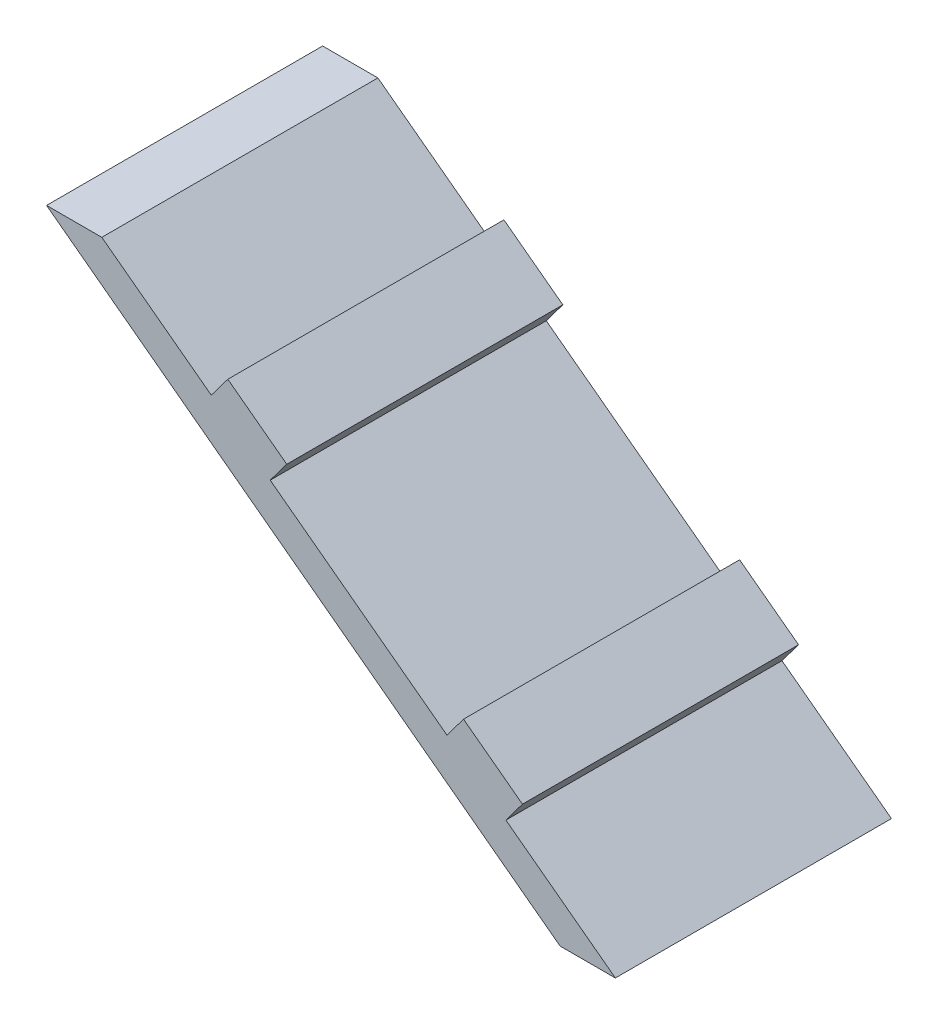
ISO-10303-21;
HEADER;
FILE_DESCRIPTION(('STEP AP214'),'2;1');
FILE_NAME('part.step','',(''),(''),'','','');
FILE_SCHEMA(('AUTOMOTIVE_DESIGN { 1 0 10303 214 1 1 1 1 }'));
ENDSEC;
DATA;
#1=APPLICATION_CONTEXT('core data for automotive mechanical design processes');
#2=APPLICATION_PROTOCOL_DEFINITION('international standard','automotive_design',2000,#1);
#3=PRODUCT_CONTEXT('',#1,'mechanical');
#4=PRODUCT('Part','Part','',(#3));
#5=PRODUCT_RELATED_PRODUCT_CATEGORY('part','',(#4));
#6=PRODUCT_DEFINITION_FORMATION('','',#4);
#7=PRODUCT_DEFINITION_CONTEXT('part definition',#1,'design');
#8=PRODUCT_DEFINITION('design','',#6,#7);
#9=PRODUCT_DEFINITION_SHAPE('','',#8);
#10=(LENGTH_UNIT() NAMED_UNIT(*) SI_UNIT(.MILLI.,.METRE.));
#11=(NAMED_UNIT(*) PLANE_ANGLE_UNIT() SI_UNIT($,.RADIAN.));
#12=(NAMED_UNIT(*) SI_UNIT($,.STERADIAN.) SOLID_ANGLE_UNIT());
#13=UNCERTAINTY_MEASURE_WITH_UNIT(LENGTH_MEASURE(1.E-05),#10,'distance_accuracy_value','');
#14=(GEOMETRIC_REPRESENTATION_CONTEXT(3) GLOBAL_UNCERTAINTY_ASSIGNED_CONTEXT((#13)) GLOBAL_UNIT_ASSIGNED_CONTEXT((#10,
#11,#12)) REPRESENTATION_CONTEXT('',''));
#15=CARTESIAN_POINT('',(0.,0.,0.));
#16=DIRECTION('',(0.,0.,1.));
#17=DIRECTION('',(1.,0.,0.));
#18=AXIS2_PLACEMENT_3D('',#15,#16,#17);
#19=CARTESIAN_POINT('',(-87.0246721025996,495.,-157.085107118555));
#20=DIRECTION('',(-0.599506963422979,-0.800369540154645,0.));
#21=DIRECTION('',(0.800369540154645,-0.599506963422979,0.));
#22=AXIS2_PLACEMENT_3D('',#19,#20,#21);
#23=PLANE('',#22);
#24=DIRECTION('',(-0.800369540154645,0.599506963422979,0.));
#25=VECTOR('',#24,1.);
#26=CARTESIAN_POINT('',(-87.0246721025996,495.,216.));
#27=LINE('',#26,#25);
#28=CARTESIAN_POINT('',(191.999999999998,286.,216.));
#29=VERTEX_POINT('',#28);
#30=CARTESIAN_POINT('',(-87.0246721025996,495.,216.));
#31=VERTEX_POINT('',#30);
#32=EDGE_CURVE('E169',#29,#31,#27,.T.);
#33=ORIENTED_EDGE('',*,*,#32,.F.);
#34=DIRECTION('',(0.,0.,1.));
#35=VECTOR('',#34,1.);
#36=CARTESIAN_POINT('',(191.999999999998,286.,-157.085107118555));
#37=LINE('',#36,#35);
#38=CARTESIAN_POINT('',(191.999999999998,286.,366.));
#39=VERTEX_POINT('',#38);
#40=EDGE_CURVE('E204',#29,#39,#37,.T.);
#41=ORIENTED_EDGE('',*,*,#40,.T.);
#42=DIRECTION('',(0.800369540154645,-0.599506963422979,0.));
#43=VECTOR('',#42,1.);
#44=CARTESIAN_POINT('',(-87.0246721025996,495.,366.));
#45=LINE('',#44,#43);
#46=CARTESIAN_POINT('',(-87.0246721025996,495.,366.));
#47=VERTEX_POINT('',#46);
#48=EDGE_CURVE('E222',#47,#39,#45,.T.);
#49=ORIENTED_EDGE('',*,*,#48,.F.);
#50=DIRECTION('',(0.,0.,1.));
#51=VECTOR('',#50,1.);
#52=CARTESIAN_POINT('',(-87.0246721025996,495.,-157.085107118555));
#53=LINE('',#52,#51);
#54=EDGE_CURVE('E201',#31,#47,#53,.T.);
#55=ORIENTED_EDGE('',*,*,#54,.F.);
#56=EDGE_LOOP('',(#33,#41,#49,#55));
#57=FACE_BOUND('',#56,.T.);
#58=ADVANCED_FACE('F87',(#57),#23,.T.);
#59=CARTESIAN_POINT('',(191.999999999998,286.,-157.085107118555));
#60=DIRECTION('',(0.,-1.,0.));
#61=DIRECTION('',(0.,0.,-1.));
#62=AXIS2_PLACEMENT_3D('',#59,#60,#61);
#63=PLANE('',#62);
#64=DIRECTION('',(-1.,0.,0.));
#65=VECTOR('',#64,1.);
#66=CARTESIAN_POINT('',(191.999999999998,286.,216.));
#67=LINE('',#66,#65);
#68=CARTESIAN_POINT('',(222.0246721026,286.,216.));
#69=VERTEX_POINT('',#68);
#70=EDGE_CURVE('E214',#69,#29,#67,.T.);
#71=ORIENTED_EDGE('',*,*,#70,.F.);
#72=DIRECTION('',(0.,0.,1.));
#73=VECTOR('',#72,1.);
#74=CARTESIAN_POINT('',(222.0246721026,286.,-157.085107118555));
#75=LINE('',#74,#73);
#76=CARTESIAN_POINT('',(222.0246721026,286.,366.));
#77=VERTEX_POINT('',#76);
#78=EDGE_CURVE('E208',#69,#77,#75,.T.);
#79=ORIENTED_EDGE('',*,*,#78,.T.);
#80=DIRECTION('',(1.,0.,0.));
#81=VECTOR('',#80,1.);
#82=CARTESIAN_POINT('',(191.999999999998,286.,366.));
#83=LINE('',#82,#81);
#84=EDGE_CURVE('E219',#39,#77,#83,.T.);
#85=ORIENTED_EDGE('',*,*,#84,.F.);
#86=ORIENTED_EDGE('',*,*,#40,.F.);
#87=EDGE_LOOP('',(#71,#79,#85,#86));
#88=FACE_BOUND('',#87,.T.);
#89=ADVANCED_FACE('F309',(#88),#63,.T.);
#90=CARTESIAN_POINT('',(222.0246721026,286.,-157.085107118555));
#91=DIRECTION('',(0.599506963422976,0.800369540154648,0.));
#92=DIRECTION('',(-0.800369540154648,0.599506963422976,0.));
#93=AXIS2_PLACEMENT_3D('',#90,#91,#92);
#94=PLANE('',#93);
#95=DIRECTION('',(0.800369540154648,-0.599506963422976,0.));
#96=VECTOR('',#95,1.);
#97=CARTESIAN_POINT('',(222.0246721026,286.,216.));
#98=LINE('',#97,#96);
#99=CARTESIAN_POINT('',(162.549290066764,330.549303657703,216.));
#100=VERTEX_POINT('',#99);
#101=EDGE_CURVE('E232',#100,#69,#98,.T.);
#102=ORIENTED_EDGE('',*,*,#101,.F.);
#103=DIRECTION('',(0.,0.,1.));
#104=VECTOR('',#103,1.);
#105=CARTESIAN_POINT('',(162.549290066763,330.549303657702,-157.085107118555));
#106=LINE('',#105,#104);
#107=CARTESIAN_POINT('',(162.549290066764,330.549303657703,366.));
#108=VERTEX_POINT('',#107);
#109=EDGE_CURVE('E157',#100,#108,#106,.T.);
#110=ORIENTED_EDGE('',*,*,#109,.T.);
#111=DIRECTION('',(-0.800369540154648,0.599506963422976,0.));
#112=VECTOR('',#111,1.);
#113=CARTESIAN_POINT('',(222.0246721026,286.,366.));
#114=LINE('',#113,#112);
#115=EDGE_CURVE('E205',#77,#108,#114,.T.);
#116=ORIENTED_EDGE('',*,*,#115,.F.);
#117=ORIENTED_EDGE('',*,*,#78,.F.);
#118=EDGE_LOOP('',(#102,#110,#116,#117));
#119=FACE_BOUND('',#118,.T.);
#120=ADVANCED_FACE('F314',(#119),#94,.T.);
#121=CARTESIAN_POINT('',(34.4901636420202,426.470417805379,216.));
#122=VERTEX_POINT('',#121);
#123=CARTESIAN_POINT('',(130.534508460578,354.529582194622,216.));
#124=VERTEX_POINT('',#123);
#125=EDGE_CURVE('E231',#122,#124,#98,.T.);
#126=ORIENTED_EDGE('',*,*,#125,.F.);
#127=DIRECTION('',(0.,0.,1.));
#128=VECTOR('',#127,1.);
#129=CARTESIAN_POINT('',(34.4901636420199,426.470417805379,-157.085107118555));
#130=LINE('',#129,#128);
#131=CARTESIAN_POINT('',(34.4901636420202,426.470417805379,366.));
#132=VERTEX_POINT('',#131);
#133=EDGE_CURVE('E12',#122,#132,#130,.T.);
#134=ORIENTED_EDGE('',*,*,#133,.T.);
#135=CARTESIAN_POINT('',(130.534508460578,354.529582194622,366.));
#136=VERTEX_POINT('',#135);
#137=EDGE_CURVE('E217',#136,#132,#114,.T.);
#138=ORIENTED_EDGE('',*,*,#137,.F.);
#139=DIRECTION('',(0.,0.,1.));
#140=VECTOR('',#139,1.);
#141=CARTESIAN_POINT('',(130.534508460577,354.529582194621,-157.085107118555));
#142=LINE('',#141,#140);
#143=EDGE_CURVE('E167',#124,#136,#142,.T.);
#144=ORIENTED_EDGE('',*,*,#143,.F.);
#145=EDGE_LOOP('',(#126,#134,#138,#144));
#146=FACE_BOUND('',#145,.T.);
#147=ADVANCED_FACE('F245',(#146),#94,.T.);
#148=DIRECTION('',(0.,0.,1.));
#149=VECTOR('',#148,1.);
#150=CARTESIAN_POINT('',(2.47538203583415,450.450696342298,-157.085107118555));
#151=LINE('',#150,#149);
#152=CARTESIAN_POINT('',(2.47538203583428,450.450696342298,216.));
#153=VERTEX_POINT('',#152);
#154=CARTESIAN_POINT('',(2.47538203583431,450.450696342298,366.));
#155=VERTEX_POINT('',#154);
#156=EDGE_CURVE('E97',#153,#155,#151,.T.);
#157=ORIENTED_EDGE('',*,*,#156,.F.);
#158=CARTESIAN_POINT('',(-57.0000000000002,495.,216.));
#159=VERTEX_POINT('',#158);
#160=EDGE_CURVE('E228',#159,#153,#98,.T.);
#161=ORIENTED_EDGE('',*,*,#160,.F.);
#162=DIRECTION('',(0.,0.,1.));
#163=VECTOR('',#162,1.);
#164=CARTESIAN_POINT('',(-57.0000000000002,495.,-157.085107118555));
#165=LINE('',#164,#163);
#166=CARTESIAN_POINT('',(-57.0000000000002,495.,366.));
#167=VERTEX_POINT('',#166);
#168=EDGE_CURVE('E211',#159,#167,#165,.T.);
#169=ORIENTED_EDGE('',*,*,#168,.T.);
#170=EDGE_CURVE('E218',#155,#167,#114,.T.);
#171=ORIENTED_EDGE('',*,*,#170,.F.);
#172=EDGE_LOOP('',(#157,#161,#169,#171));
#173=FACE_BOUND('',#172,.T.);
#174=ADVANCED_FACE('F272',(#173),#94,.T.);
#175=CARTESIAN_POINT('',(-57.0000000000002,495.,-157.085107118555));
#176=DIRECTION('',(0.,1.,0.));
#177=DIRECTION('',(0.,0.,1.));
#178=AXIS2_PLACEMENT_3D('',#175,#176,#177);
#179=PLANE('',#178);
#180=DIRECTION('',(1.,0.,0.));
#181=VECTOR('',#180,1.);
#182=CARTESIAN_POINT('',(-57.0000000000002,495.,216.));
#183=LINE('',#182,#181);
#184=EDGE_CURVE('E200',#31,#159,#183,.T.);
#185=ORIENTED_EDGE('',*,*,#184,.F.);
#186=ORIENTED_EDGE('',*,*,#54,.T.);
#187=DIRECTION('',(-1.,0.,0.));
#188=VECTOR('',#187,1.);
#189=CARTESIAN_POINT('',(-57.0000000000002,495.,366.));
#190=LINE('',#189,#188);
#191=EDGE_CURVE('E192',#167,#47,#190,.T.);
#192=ORIENTED_EDGE('',*,*,#191,.F.);
#193=ORIENTED_EDGE('',*,*,#168,.F.);
#194=EDGE_LOOP('',(#185,#186,#192,#193));
#195=FACE_BOUND('',#194,.T.);
#196=ADVANCED_FACE('F276',(#195),#179,.T.);
#197=CARTESIAN_POINT('',(182.,286.,216.));
#198=DIRECTION('',(0.,0.,1.));
#199=DIRECTION('',(1.,0.,0.));
#200=AXIS2_PLACEMENT_3D('',#197,#198,#199);
#201=PLANE('',#200);
#202=ORIENTED_EDGE('',*,*,#184,.T.);
#203=ORIENTED_EDGE('',*,*,#160,.T.);
#204=DIRECTION('',(-0.59950696342298,-0.800369540154645,0.));
#205=VECTOR('',#204,1.);
#206=CARTESIAN_POINT('',(2.47538203583415,450.450696342298,216.));
#207=LINE('',#206,#205);
#208=CARTESIAN_POINT('',(11.4679864871788,462.456239444618,216.));
#209=VERTEX_POINT('',#208);
#210=EDGE_CURVE('E190',#209,#153,#207,.T.);
#211=ORIENTED_EDGE('',*,*,#210,.F.);
#212=DIRECTION('',(-0.800369540154645,0.59950696342298,0.));
#213=VECTOR('',#212,1.);
#214=CARTESIAN_POINT('',(11.4679864871788,462.456239444618,216.));
#215=LINE('',#214,#213);
#216=CARTESIAN_POINT('',(43.4827680933646,438.475960907698,216.));
#217=VERTEX_POINT('',#216);
#218=EDGE_CURVE('E193',#217,#209,#215,.T.);
#219=ORIENTED_EDGE('',*,*,#218,.F.);
#220=DIRECTION('',(-0.59950696342298,-0.800369540154645,0.));
#221=VECTOR('',#220,1.);
#222=CARTESIAN_POINT('',(34.4901636420199,426.470417805379,216.));
#223=LINE('',#222,#221);
#224=EDGE_CURVE('E179',#217,#122,#223,.T.);
#225=ORIENTED_EDGE('',*,*,#224,.T.);
#226=ORIENTED_EDGE('',*,*,#125,.T.);
#227=DIRECTION('',(-0.59950696342298,-0.800369540154645,0.));
#228=VECTOR('',#227,1.);
#229=CARTESIAN_POINT('',(130.534508460577,354.529582194621,216.));
#230=LINE('',#229,#228);
#231=CARTESIAN_POINT('',(139.527112911922,366.535125296941,216.));
#232=VERTEX_POINT('',#231);
#233=EDGE_CURVE('E135',#232,#124,#230,.T.);
#234=ORIENTED_EDGE('',*,*,#233,.F.);
#235=DIRECTION('',(-0.800369540154646,0.599506963422978,0.));
#236=VECTOR('',#235,1.);
#237=CARTESIAN_POINT('',(139.527112911922,366.535125296941,216.));
#238=LINE('',#237,#236);
#239=CARTESIAN_POINT('',(171.541894518108,342.554846760022,216.));
#240=VERTEX_POINT('',#239);
#241=EDGE_CURVE('E138',#240,#232,#238,.T.);
#242=ORIENTED_EDGE('',*,*,#241,.F.);
#243=DIRECTION('',(-0.59950696342298,-0.800369540154645,0.));
#244=VECTOR('',#243,1.);
#245=CARTESIAN_POINT('',(162.549290066763,330.549303657702,216.));
#246=LINE('',#245,#244);
#247=EDGE_CURVE('E144',#240,#100,#246,.T.);
#248=ORIENTED_EDGE('',*,*,#247,.T.);
#249=ORIENTED_EDGE('',*,*,#101,.T.);
#250=ORIENTED_EDGE('',*,*,#70,.T.);
#251=ORIENTED_EDGE('',*,*,#32,.T.);
#252=EDGE_LOOP('',(#202,#203,#211,#219,#225,#226,#234,#242,#248,#249,#250,#251));
#253=FACE_BOUND('',#252,.T.);
#254=ADVANCED_FACE('F141',(#253),#201,.F.);
#255=CARTESIAN_POINT('',(0.,0.,366.));
#256=DIRECTION('',(0.,0.,1.));
#257=DIRECTION('',(1.,0.,0.));
#258=AXIS2_PLACEMENT_3D('',#255,#256,#257);
#259=PLANE('',#258);
#260=ORIENTED_EDGE('',*,*,#191,.T.);
#261=ORIENTED_EDGE('',*,*,#48,.T.);
#262=ORIENTED_EDGE('',*,*,#84,.T.);
#263=ORIENTED_EDGE('',*,*,#115,.T.);
#264=DIRECTION('',(0.59950696342298,0.800369540154645,0.));
#265=VECTOR('',#264,1.);
#266=CARTESIAN_POINT('',(162.549290066763,330.549303657702,366.));
#267=LINE('',#266,#265);
#268=CARTESIAN_POINT('',(171.541894518108,342.554846760022,366.));
#269=VERTEX_POINT('',#268);
#270=EDGE_CURVE('E163',#108,#269,#267,.T.);
#271=ORIENTED_EDGE('',*,*,#270,.T.);
#272=DIRECTION('',(0.800369540154646,-0.599506963422979,0.));
#273=VECTOR('',#272,1.);
#274=CARTESIAN_POINT('',(139.527112911922,366.535125296941,366.));
#275=LINE('',#274,#273);
#276=CARTESIAN_POINT('',(139.527112911922,366.535125296941,366.));
#277=VERTEX_POINT('',#276);
#278=EDGE_CURVE('E161',#277,#269,#275,.T.);
#279=ORIENTED_EDGE('',*,*,#278,.F.);
#280=DIRECTION('',(0.59950696342298,0.800369540154645,0.));
#281=VECTOR('',#280,1.);
#282=CARTESIAN_POINT('',(130.534508460577,354.529582194621,366.));
#283=LINE('',#282,#281);
#284=EDGE_CURVE('E172',#136,#277,#283,.T.);
#285=ORIENTED_EDGE('',*,*,#284,.F.);
#286=ORIENTED_EDGE('',*,*,#137,.T.);
#287=DIRECTION('',(0.59950696342298,0.800369540154645,0.));
#288=VECTOR('',#287,1.);
#289=CARTESIAN_POINT('',(34.4901636420199,426.470417805379,366.));
#290=LINE('',#289,#288);
#291=CARTESIAN_POINT('',(43.4827680933646,438.475960907698,366.));
#292=VERTEX_POINT('',#291);
#293=EDGE_CURVE('E181',#132,#292,#290,.T.);
#294=ORIENTED_EDGE('',*,*,#293,.T.);
#295=DIRECTION('',(0.800369540154645,-0.59950696342298,0.));
#296=VECTOR('',#295,1.);
#297=CARTESIAN_POINT('',(11.4679864871788,462.456239444618,366.));
#298=LINE('',#297,#296);
#299=CARTESIAN_POINT('',(11.4679864871788,462.456239444618,366.));
#300=VERTEX_POINT('',#299);
#301=EDGE_CURVE('E186',#300,#292,#298,.T.);
#302=ORIENTED_EDGE('',*,*,#301,.F.);
#303=DIRECTION('',(0.59950696342298,0.800369540154645,0.));
#304=VECTOR('',#303,1.);
#305=CARTESIAN_POINT('',(2.47538203583415,450.450696342298,366.));
#306=LINE('',#305,#304);
#307=EDGE_CURVE('E175',#155,#300,#306,.T.);
#308=ORIENTED_EDGE('',*,*,#307,.F.);
#309=ORIENTED_EDGE('',*,*,#170,.T.);
#310=EDGE_LOOP('',(#260,#261,#262,#263,#271,#279,#285,#286,#294,#302,#308,#309));
#311=FACE_BOUND('',#310,.T.);
#312=ADVANCED_FACE('F261',(#311),#259,.T.);
#313=CARTESIAN_POINT('',(130.534508460577,354.529582194621,-157.085107118555));
#314=DIRECTION('',(0.800369540154645,-0.59950696342298,0.));
#315=DIRECTION('',(0.59950696342298,0.800369540154645,0.));
#316=AXIS2_PLACEMENT_3D('',#313,#314,#315);
#317=PLANE('',#316);
#318=DIRECTION('',(0.,0.,1.));
#319=VECTOR('',#318,1.);
#320=CARTESIAN_POINT('',(139.527112911922,366.535125296941,-157.085107118555));
#321=LINE('',#320,#319);
#322=EDGE_CURVE('E91',#232,#277,#321,.T.);
#323=ORIENTED_EDGE('',*,*,#322,.F.);
#324=ORIENTED_EDGE('',*,*,#233,.T.);
#325=ORIENTED_EDGE('',*,*,#143,.T.);
#326=ORIENTED_EDGE('',*,*,#284,.T.);
#327=EDGE_LOOP('',(#323,#324,#325,#326));
#328=FACE_BOUND('',#327,.T.);
#329=ADVANCED_FACE('F89',(#328),#317,.F.);
#330=CARTESIAN_POINT('',(162.549290066763,330.549303657702,-157.085107118555));
#331=DIRECTION('',(0.800369540154645,-0.59950696342298,0.));
#332=DIRECTION('',(0.59950696342298,0.800369540154645,0.));
#333=AXIS2_PLACEMENT_3D('',#330,#331,#332);
#334=PLANE('',#333);
#335=ORIENTED_EDGE('',*,*,#247,.F.);
#336=DIRECTION('',(0.,0.,1.));
#337=VECTOR('',#336,1.);
#338=CARTESIAN_POINT('',(171.541894518108,342.554846760022,-157.085107118555));
#339=LINE('',#338,#337);
#340=EDGE_CURVE('E154',#240,#269,#339,.T.);
#341=ORIENTED_EDGE('',*,*,#340,.T.);
#342=ORIENTED_EDGE('',*,*,#270,.F.);
#343=ORIENTED_EDGE('',*,*,#109,.F.);
#344=EDGE_LOOP('',(#335,#341,#342,#343));
#345=FACE_BOUND('',#344,.T.);
#346=ADVANCED_FACE('F152',(#345),#334,.T.);
#347=CARTESIAN_POINT('',(139.527112911922,366.535125296941,-157.085107118555));
#348=DIRECTION('',(-0.599506963422978,-0.800369540154646,0.));
#349=DIRECTION('',(0.800369540154646,-0.599506963422978,0.));
#350=AXIS2_PLACEMENT_3D('',#347,#348,#349);
#351=PLANE('',#350);
#352=ORIENTED_EDGE('',*,*,#340,.F.);
#353=ORIENTED_EDGE('',*,*,#241,.T.);
#354=ORIENTED_EDGE('',*,*,#322,.T.);
#355=ORIENTED_EDGE('',*,*,#278,.T.);
#356=EDGE_LOOP('',(#352,#353,#354,#355));
#357=FACE_BOUND('',#356,.T.);
#358=ADVANCED_FACE('F159',(#357),#351,.F.);
#359=CARTESIAN_POINT('',(2.47538203583415,450.450696342298,-157.085107118555));
#360=DIRECTION('',(0.800369540154645,-0.59950696342298,0.));
#361=DIRECTION('',(0.59950696342298,0.800369540154645,0.));
#362=AXIS2_PLACEMENT_3D('',#359,#360,#361);
#363=PLANE('',#362);
#364=DIRECTION('',(0.,0.,1.));
#365=VECTOR('',#364,1.);
#366=CARTESIAN_POINT('',(11.4679864871788,462.456239444618,-157.085107118555));
#367=LINE('',#366,#365);
#368=EDGE_CURVE('E177',#209,#300,#367,.T.);
#369=ORIENTED_EDGE('',*,*,#368,.F.);
#370=ORIENTED_EDGE('',*,*,#210,.T.);
#371=ORIENTED_EDGE('',*,*,#156,.T.);
#372=ORIENTED_EDGE('',*,*,#307,.T.);
#373=EDGE_LOOP('',(#369,#370,#371,#372));
#374=FACE_BOUND('',#373,.T.);
#375=ADVANCED_FACE('F295',(#374),#363,.F.);
#376=CARTESIAN_POINT('',(34.4901636420199,426.470417805379,-157.085107118555));
#377=DIRECTION('',(0.800369540154645,-0.59950696342298,0.));
#378=DIRECTION('',(0.59950696342298,0.800369540154645,0.));
#379=AXIS2_PLACEMENT_3D('',#376,#377,#378);
#380=PLANE('',#379);
#381=ORIENTED_EDGE('',*,*,#224,.F.);
#382=DIRECTION('',(0.,0.,1.));
#383=VECTOR('',#382,1.);
#384=CARTESIAN_POINT('',(43.4827680933646,438.475960907698,-157.085107118555));
#385=LINE('',#384,#383);
#386=EDGE_CURVE('E180',#217,#292,#385,.T.);
#387=ORIENTED_EDGE('',*,*,#386,.T.);
#388=ORIENTED_EDGE('',*,*,#293,.F.);
#389=ORIENTED_EDGE('',*,*,#133,.F.);
#390=EDGE_LOOP('',(#381,#387,#388,#389));
#391=FACE_BOUND('',#390,.T.);
#392=ADVANCED_FACE('F297',(#391),#380,.T.);
#393=CARTESIAN_POINT('',(11.4679864871788,462.456239444618,-157.085107118555));
#394=DIRECTION('',(-0.59950696342298,-0.800369540154645,0.));
#395=DIRECTION('',(0.800369540154645,-0.59950696342298,0.));
#396=AXIS2_PLACEMENT_3D('',#393,#394,#395);
#397=PLANE('',#396);
#398=ORIENTED_EDGE('',*,*,#386,.F.);
#399=ORIENTED_EDGE('',*,*,#218,.T.);
#400=ORIENTED_EDGE('',*,*,#368,.T.);
#401=ORIENTED_EDGE('',*,*,#301,.T.);
#402=EDGE_LOOP('',(#398,#399,#400,#401));
#403=FACE_BOUND('',#402,.T.);
#404=ADVANCED_FACE('F294',(#403),#397,.F.);
#405=CLOSED_SHELL('',(#58,#89,#120,#147,#174,#196,#254,#312,#329,#346,#358,#375,#392,#404));
#406=MANIFOLD_SOLID_BREP('B2',#405);
#407=ADVANCED_BREP_SHAPE_REPRESENTATION('',(#18,#406),#14);
#408=SHAPE_DEFINITION_REPRESENTATION(#9,#407);
ENDSEC;
END-ISO-10303-21;
